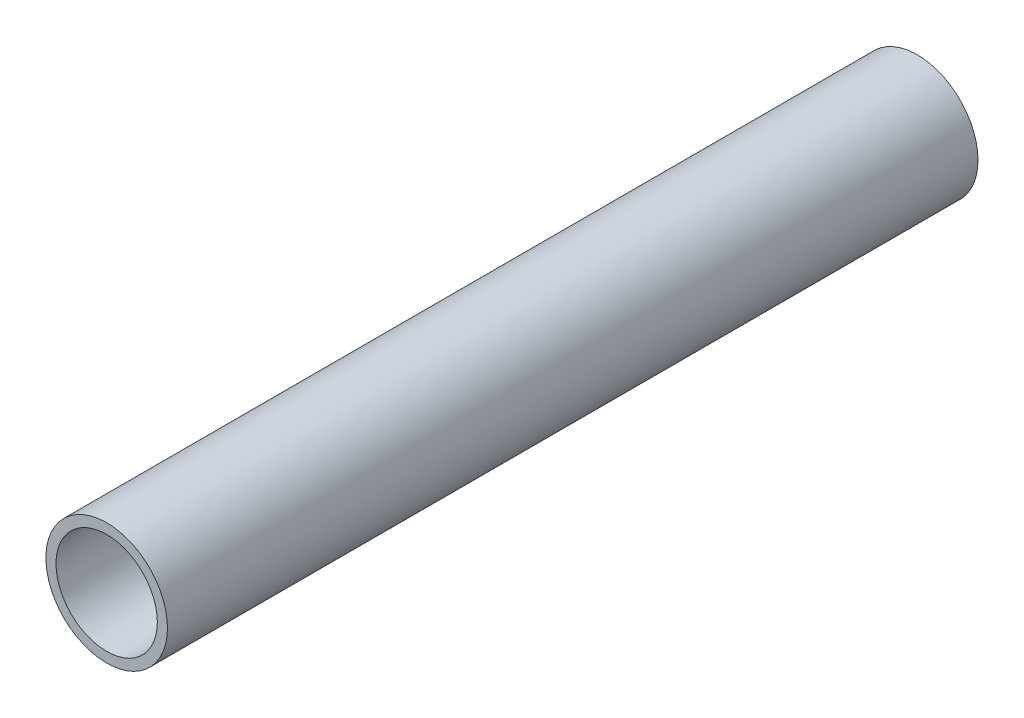
ISO-10303-21;
HEADER;
FILE_DESCRIPTION(('STEP AP214'),'2;1');
FILE_NAME('part.step','',(''),(''),'','','');
FILE_SCHEMA(('AUTOMOTIVE_DESIGN { 1 0 10303 214 1 1 1 1 }'));
ENDSEC;
DATA;
#1=APPLICATION_CONTEXT('core data for automotive mechanical design processes');
#2=APPLICATION_PROTOCOL_DEFINITION('international standard','automotive_design',2000,#1);
#3=PRODUCT_CONTEXT('',#1,'mechanical');
#4=PRODUCT('Part','Part','',(#3));
#5=PRODUCT_RELATED_PRODUCT_CATEGORY('part','',(#4));
#6=PRODUCT_DEFINITION_FORMATION('','',#4);
#7=PRODUCT_DEFINITION_CONTEXT('part definition',#1,'design');
#8=PRODUCT_DEFINITION('design','',#6,#7);
#9=PRODUCT_DEFINITION_SHAPE('','',#8);
#10=(LENGTH_UNIT() NAMED_UNIT(*) SI_UNIT(.MILLI.,.METRE.));
#11=(NAMED_UNIT(*) PLANE_ANGLE_UNIT() SI_UNIT($,.RADIAN.));
#12=(NAMED_UNIT(*) SI_UNIT($,.STERADIAN.) SOLID_ANGLE_UNIT());
#13=UNCERTAINTY_MEASURE_WITH_UNIT(LENGTH_MEASURE(1.E-05),#10,'distance_accuracy_value','');
#14=(GEOMETRIC_REPRESENTATION_CONTEXT(3) GLOBAL_UNCERTAINTY_ASSIGNED_CONTEXT((#13)) GLOBAL_UNIT_ASSIGNED_CONTEXT((#10,
#11,#12)) REPRESENTATION_CONTEXT('',''));
#15=CARTESIAN_POINT('',(0.,0.,0.));
#16=DIRECTION('',(0.,0.,1.));
#17=DIRECTION('',(1.,0.,0.));
#18=AXIS2_PLACEMENT_3D('',#15,#16,#17);
#19=CARTESIAN_POINT('',(0.,0.,200.));
#20=DIRECTION('',(0.,0.,1.));
#21=DIRECTION('',(1.,0.,0.));
#22=AXIS2_PLACEMENT_3D('',#19,#20,#21);
#23=PLANE('',#22);
#24=CARTESIAN_POINT('',(0.,0.,200.));
#25=DIRECTION('',(0.,0.,1.));
#26=DIRECTION('',(1.,0.,0.));
#27=AXIS2_PLACEMENT_3D('',#24,#25,#26);
#28=CIRCLE('',#27,15.);
#29=CARTESIAN_POINT('',(15.,0.,200.));
#30=VERTEX_POINT('',#29);
#31=EDGE_CURVE('E10',#30,#30,#28,.T.);
#32=ORIENTED_EDGE('',*,*,#31,.T.);
#33=EDGE_LOOP('',(#32));
#34=FACE_BOUND('',#33,.T.);
#35=CARTESIAN_POINT('',(0.,0.,200.));
#36=DIRECTION('',(0.,0.,1.));
#37=DIRECTION('',(1.,0.,0.));
#38=AXIS2_PLACEMENT_3D('',#35,#36,#37);
#39=CIRCLE('',#38,12.5);
#40=CARTESIAN_POINT('',(12.5,0.,200.));
#41=VERTEX_POINT('',#40);
#42=EDGE_CURVE('E48',#41,#41,#39,.T.);
#43=ORIENTED_EDGE('',*,*,#42,.F.);
#44=EDGE_LOOP('',(#43));
#45=FACE_BOUND('',#44,.T.);
#46=ADVANCED_FACE('F37',(#34,#45),#23,.T.);
#47=CARTESIAN_POINT('',(0.,0.,0.));
#48=DIRECTION('',(0.,0.,1.));
#49=DIRECTION('',(1.,0.,0.));
#50=AXIS2_PLACEMENT_3D('',#47,#48,#49);
#51=PLANE('',#50);
#52=CARTESIAN_POINT('',(0.,0.,0.));
#53=DIRECTION('',(0.,0.,1.));
#54=DIRECTION('',(1.,0.,0.));
#55=AXIS2_PLACEMENT_3D('',#52,#53,#54);
#56=CIRCLE('',#55,15.);
#57=CARTESIAN_POINT('',(15.,0.,0.));
#58=VERTEX_POINT('',#57);
#59=EDGE_CURVE('E41',#58,#58,#56,.T.);
#60=ORIENTED_EDGE('',*,*,#59,.F.);
#61=EDGE_LOOP('',(#60));
#62=FACE_BOUND('',#61,.T.);
#63=CARTESIAN_POINT('',(0.,0.,0.));
#64=DIRECTION('',(0.,0.,1.));
#65=DIRECTION('',(1.,0.,0.));
#66=AXIS2_PLACEMENT_3D('',#63,#64,#65);
#67=CIRCLE('',#66,12.5);
#68=CARTESIAN_POINT('',(12.5,0.,0.));
#69=VERTEX_POINT('',#68);
#70=EDGE_CURVE('E50',#69,#69,#67,.T.);
#71=ORIENTED_EDGE('',*,*,#70,.T.);
#72=EDGE_LOOP('',(#71));
#73=FACE_BOUND('',#72,.T.);
#74=ADVANCED_FACE('F60',(#62,#73),#51,.F.);
#75=CARTESIAN_POINT('',(0.,0.,200.));
#76=DIRECTION('',(0.,0.,-1.));
#77=DIRECTION('',(-1.,0.,0.));
#78=AXIS2_PLACEMENT_3D('',#75,#76,#77);
#79=CYLINDRICAL_SURFACE('',#78,15.);
#80=ORIENTED_EDGE('',*,*,#31,.F.);
#81=EDGE_LOOP('',(#80));
#82=FACE_BOUND('',#81,.T.);
#83=ORIENTED_EDGE('',*,*,#59,.T.);
#84=EDGE_LOOP('',(#83));
#85=FACE_BOUND('',#84,.T.);
#86=ADVANCED_FACE('F39',(#82,#85),#79,.T.);
#87=CARTESIAN_POINT('',(0.,0.,200.));
#88=DIRECTION('',(0.,0.,-1.));
#89=DIRECTION('',(-1.,0.,0.));
#90=AXIS2_PLACEMENT_3D('',#87,#88,#89);
#91=CYLINDRICAL_SURFACE('',#90,12.5);
#92=ORIENTED_EDGE('',*,*,#42,.T.);
#93=EDGE_LOOP('',(#92));
#94=FACE_BOUND('',#93,.T.);
#95=ORIENTED_EDGE('',*,*,#70,.F.);
#96=EDGE_LOOP('',(#95));
#97=FACE_BOUND('',#96,.T.);
#98=ADVANCED_FACE('F56',(#94,#97),#91,.F.);
#99=CLOSED_SHELL('',(#46,#74,#86,#98));
#100=MANIFOLD_SOLID_BREP('B2',#99);
#101=ADVANCED_BREP_SHAPE_REPRESENTATION('',(#18,#100),#14);
#102=SHAPE_DEFINITION_REPRESENTATION(#9,#101);
ENDSEC;
END-ISO-10303-21;
